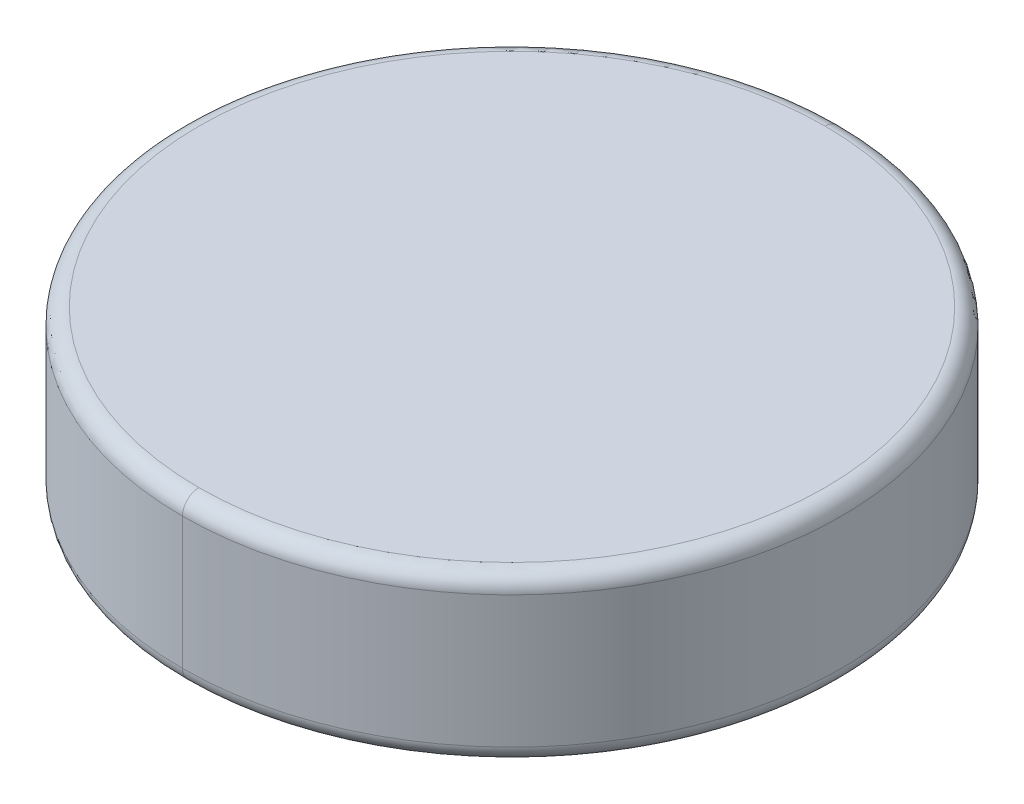
ISO-10303-21;
HEADER;
FILE_DESCRIPTION(('STEP AP214'),'2;1');
FILE_NAME('part.step','',(''),(''),'','','');
FILE_SCHEMA(('AUTOMOTIVE_DESIGN { 1 0 10303 214 1 1 1 1 }'));
ENDSEC;
DATA;
#1=APPLICATION_CONTEXT('core data for automotive mechanical design processes');
#2=APPLICATION_PROTOCOL_DEFINITION('international standard','automotive_design',2000,#1);
#3=PRODUCT_CONTEXT('',#1,'mechanical');
#4=PRODUCT('Part','Part','',(#3));
#5=PRODUCT_RELATED_PRODUCT_CATEGORY('part','',(#4));
#6=PRODUCT_DEFINITION_FORMATION('','',#4);
#7=PRODUCT_DEFINITION_CONTEXT('part definition',#1,'design');
#8=PRODUCT_DEFINITION('design','',#6,#7);
#9=PRODUCT_DEFINITION_SHAPE('','',#8);
#10=(LENGTH_UNIT() NAMED_UNIT(*) SI_UNIT(.MILLI.,.METRE.));
#11=(NAMED_UNIT(*) PLANE_ANGLE_UNIT() SI_UNIT($,.RADIAN.));
#12=(NAMED_UNIT(*) SI_UNIT($,.STERADIAN.) SOLID_ANGLE_UNIT());
#13=UNCERTAINTY_MEASURE_WITH_UNIT(LENGTH_MEASURE(1.E-05),#10,'distance_accuracy_value','');
#14=(GEOMETRIC_REPRESENTATION_CONTEXT(3) GLOBAL_UNCERTAINTY_ASSIGNED_CONTEXT((#13)) GLOBAL_UNIT_ASSIGNED_CONTEXT((#10,
#11,#12)) REPRESENTATION_CONTEXT('',''));
#15=CARTESIAN_POINT('',(0.,0.,0.));
#16=DIRECTION('',(0.,0.,1.));
#17=DIRECTION('',(1.,0.,0.));
#18=AXIS2_PLACEMENT_3D('',#15,#16,#17);
#19=CARTESIAN_POINT('',(0.,1.27,0.));
#20=DIRECTION('',(0.,1.,0.));
#21=DIRECTION('',(0.,0.,1.));
#22=AXIS2_PLACEMENT_3D('',#19,#20,#21);
#23=TOROIDAL_SURFACE('',#22,6.0325,0.3175);
#24=CARTESIAN_POINT('',(0.,1.27,-6.0325));
#25=DIRECTION('',(1.,0.,0.));
#26=DIRECTION('',(0.,0.,-1.));
#27=AXIS2_PLACEMENT_3D('',#24,#25,#26);
#28=CIRCLE('',#27,0.3175);
#29=CARTESIAN_POINT('',(0.,1.27,-6.35));
#30=VERTEX_POINT('',#29);
#31=CARTESIAN_POINT('',(0.,1.5875,-6.0325));
#32=VERTEX_POINT('',#31);
#33=EDGE_CURVE('E99',#30,#32,#28,.T.);
#34=ORIENTED_EDGE('',*,*,#33,.F.);
#35=CARTESIAN_POINT('',(0.,1.27,0.));
#36=DIRECTION('',(0.,-1.,0.));
#37=DIRECTION('',(0.,0.,1.));
#38=AXIS2_PLACEMENT_3D('',#35,#36,#37);
#39=CIRCLE('',#38,6.35);
#40=CARTESIAN_POINT('',(0.,1.27,6.35));
#41=VERTEX_POINT('',#40);
#42=EDGE_CURVE('E97',#41,#30,#39,.T.);
#43=ORIENTED_EDGE('',*,*,#42,.F.);
#44=CARTESIAN_POINT('',(0.,1.27,6.0325));
#45=DIRECTION('',(-1.,0.,0.));
#46=DIRECTION('',(0.,0.,1.));
#47=AXIS2_PLACEMENT_3D('',#44,#45,#46);
#48=CIRCLE('',#47,0.3175);
#49=CARTESIAN_POINT('',(0.,1.5875,6.0325));
#50=VERTEX_POINT('',#49);
#51=EDGE_CURVE('E83',#41,#50,#48,.T.);
#52=ORIENTED_EDGE('',*,*,#51,.T.);
#53=CARTESIAN_POINT('',(0.,1.5875,0.));
#54=DIRECTION('',(0.,1.,0.));
#55=DIRECTION('',(0.,0.,1.));
#56=AXIS2_PLACEMENT_3D('',#53,#54,#55);
#57=CIRCLE('',#56,6.0325);
#58=EDGE_CURVE('E26',#32,#50,#57,.T.);
#59=ORIENTED_EDGE('',*,*,#58,.F.);
#60=EDGE_LOOP('',(#34,#43,#52,#59));
#61=FACE_BOUND('',#60,.T.);
#62=ADVANCED_FACE('F15',(#61),#23,.T.);
#63=CARTESIAN_POINT('',(0.,-1.27,0.));
#64=DIRECTION('',(0.,1.,0.));
#65=DIRECTION('',(0.,0.,1.));
#66=AXIS2_PLACEMENT_3D('',#63,#64,#65);
#67=TOROIDAL_SURFACE('',#66,6.0325,0.3175);
#68=CARTESIAN_POINT('',(0.,-1.27,-6.0325));
#69=DIRECTION('',(1.,0.,0.));
#70=DIRECTION('',(0.,0.,-1.));
#71=AXIS2_PLACEMENT_3D('',#68,#69,#70);
#72=CIRCLE('',#71,0.3175);
#73=CARTESIAN_POINT('',(0.,-1.5875,-6.0325));
#74=VERTEX_POINT('',#73);
#75=CARTESIAN_POINT('',(0.,-1.27,-6.35));
#76=VERTEX_POINT('',#75);
#77=EDGE_CURVE('E74',#74,#76,#72,.T.);
#78=ORIENTED_EDGE('',*,*,#77,.F.);
#79=CARTESIAN_POINT('',(0.,-1.5875,0.));
#80=DIRECTION('',(0.,-1.,0.));
#81=DIRECTION('',(0.,0.,1.));
#82=AXIS2_PLACEMENT_3D('',#79,#80,#81);
#83=CIRCLE('',#82,6.0325);
#84=CARTESIAN_POINT('',(0.,-1.5875,6.0325));
#85=VERTEX_POINT('',#84);
#86=EDGE_CURVE('E10',#85,#74,#83,.T.);
#87=ORIENTED_EDGE('',*,*,#86,.F.);
#88=CARTESIAN_POINT('',(0.,-1.27,6.0325));
#89=DIRECTION('',(-1.,0.,0.));
#90=DIRECTION('',(0.,0.,1.));
#91=AXIS2_PLACEMENT_3D('',#88,#89,#90);
#92=CIRCLE('',#91,0.3175);
#93=CARTESIAN_POINT('',(0.,-1.27,6.35));
#94=VERTEX_POINT('',#93);
#95=EDGE_CURVE('E81',#85,#94,#92,.T.);
#96=ORIENTED_EDGE('',*,*,#95,.T.);
#97=CARTESIAN_POINT('',(0.,-1.27,0.));
#98=DIRECTION('',(0.,1.,0.));
#99=DIRECTION('',(0.,0.,1.));
#100=AXIS2_PLACEMENT_3D('',#97,#98,#99);
#101=CIRCLE('',#100,6.35);
#102=EDGE_CURVE('E19',#76,#94,#101,.T.);
#103=ORIENTED_EDGE('',*,*,#102,.F.);
#104=EDGE_LOOP('',(#78,#87,#96,#103));
#105=FACE_BOUND('',#104,.T.);
#106=ADVANCED_FACE('F17',(#105),#67,.T.);
#107=CARTESIAN_POINT('',(0.,-1.5875,0.));
#108=DIRECTION('',(0.,1.,0.));
#109=DIRECTION('',(1.,0.,0.));
#110=AXIS2_PLACEMENT_3D('',#107,#108,#109);
#111=PLANE('',#110);
#112=ORIENTED_EDGE('',*,*,#86,.T.);
#113=CARTESIAN_POINT('',(0.,-1.5875,0.));
#114=DIRECTION('',(0.,-1.,0.));
#115=DIRECTION('',(0.,0.,1.));
#116=AXIS2_PLACEMENT_3D('',#113,#114,#115);
#117=CIRCLE('',#116,6.0325);
#118=EDGE_CURVE('E72',#74,#85,#117,.T.);
#119=ORIENTED_EDGE('',*,*,#118,.T.);
#120=EDGE_LOOP('',(#112,#119));
#121=FACE_BOUND('',#120,.T.);
#122=ADVANCED_FACE('F70',(#121),#111,.F.);
#123=CARTESIAN_POINT('',(0.,1.5875,0.));
#124=DIRECTION('',(0.,1.,0.));
#125=DIRECTION('',(1.,0.,0.));
#126=AXIS2_PLACEMENT_3D('',#123,#124,#125);
#127=PLANE('',#126);
#128=CARTESIAN_POINT('',(0.,1.5875,0.));
#129=DIRECTION('',(0.,1.,0.));
#130=DIRECTION('',(0.,0.,1.));
#131=AXIS2_PLACEMENT_3D('',#128,#129,#130);
#132=CIRCLE('',#131,6.0325);
#133=EDGE_CURVE('E91',#50,#32,#132,.T.);
#134=ORIENTED_EDGE('',*,*,#133,.T.);
#135=ORIENTED_EDGE('',*,*,#58,.T.);
#136=EDGE_LOOP('',(#134,#135));
#137=FACE_BOUND('',#136,.T.);
#138=ADVANCED_FACE('F139',(#137),#127,.T.);
#139=CARTESIAN_POINT('',(0.,1.5875,0.));
#140=DIRECTION('',(0.,-1.,0.));
#141=DIRECTION('',(0.,0.,-1.));
#142=AXIS2_PLACEMENT_3D('',#139,#140,#141);
#143=CYLINDRICAL_SURFACE('',#142,6.35);
#144=DIRECTION('',(0.,-1.,0.));
#145=VECTOR('',#144,1.);
#146=CARTESIAN_POINT('',(0.,1.5875,6.35));
#147=LINE('',#146,#145);
#148=EDGE_CURVE('E98',#41,#94,#147,.T.);
#149=ORIENTED_EDGE('',*,*,#148,.F.);
#150=ORIENTED_EDGE('',*,*,#42,.T.);
#151=DIRECTION('',(0.,-1.,0.));
#152=VECTOR('',#151,1.);
#153=CARTESIAN_POINT('',(0.,1.5875,-6.35));
#154=LINE('',#153,#152);
#155=EDGE_CURVE('E95',#30,#76,#154,.T.);
#156=ORIENTED_EDGE('',*,*,#155,.T.);
#157=ORIENTED_EDGE('',*,*,#102,.T.);
#158=EDGE_LOOP('',(#149,#150,#156,#157));
#159=FACE_BOUND('',#158,.T.);
#160=ADVANCED_FACE('F125',(#159),#143,.T.);
#161=CARTESIAN_POINT('',(0.,1.5875,0.));
#162=DIRECTION('',(0.,-1.,0.));
#163=DIRECTION('',(0.,0.,-1.));
#164=AXIS2_PLACEMENT_3D('',#161,#162,#163);
#165=CYLINDRICAL_SURFACE('',#164,6.35);
#166=CARTESIAN_POINT('',(0.,1.27,0.));
#167=DIRECTION('',(0.,-1.,0.));
#168=DIRECTION('',(0.,0.,1.));
#169=AXIS2_PLACEMENT_3D('',#166,#167,#168);
#170=CIRCLE('',#169,6.35);
#171=EDGE_CURVE('E94',#30,#41,#170,.T.);
#172=ORIENTED_EDGE('',*,*,#171,.T.);
#173=ORIENTED_EDGE('',*,*,#148,.T.);
#174=CARTESIAN_POINT('',(0.,-1.27,0.));
#175=DIRECTION('',(0.,1.,0.));
#176=DIRECTION('',(0.,0.,1.));
#177=AXIS2_PLACEMENT_3D('',#174,#175,#176);
#178=CIRCLE('',#177,6.35);
#179=EDGE_CURVE('E78',#94,#76,#178,.T.);
#180=ORIENTED_EDGE('',*,*,#179,.T.);
#181=ORIENTED_EDGE('',*,*,#155,.F.);
#182=EDGE_LOOP('',(#172,#173,#180,#181));
#183=FACE_BOUND('',#182,.T.);
#184=ADVANCED_FACE('F116',(#183),#165,.T.);
#185=CARTESIAN_POINT('',(0.,-1.27,0.));
#186=DIRECTION('',(0.,1.,0.));
#187=DIRECTION('',(0.,0.,1.));
#188=AXIS2_PLACEMENT_3D('',#185,#186,#187);
#189=TOROIDAL_SURFACE('',#188,6.0325,0.3175);
#190=ORIENTED_EDGE('',*,*,#118,.F.);
#191=ORIENTED_EDGE('',*,*,#77,.T.);
#192=ORIENTED_EDGE('',*,*,#179,.F.);
#193=ORIENTED_EDGE('',*,*,#95,.F.);
#194=EDGE_LOOP('',(#190,#191,#192,#193));
#195=FACE_BOUND('',#194,.T.);
#196=ADVANCED_FACE('F80',(#195),#189,.T.);
#197=CARTESIAN_POINT('',(0.,1.27,0.));
#198=DIRECTION('',(0.,1.,0.));
#199=DIRECTION('',(0.,0.,1.));
#200=AXIS2_PLACEMENT_3D('',#197,#198,#199);
#201=TOROIDAL_SURFACE('',#200,6.0325,0.3175);
#202=ORIENTED_EDGE('',*,*,#171,.F.);
#203=ORIENTED_EDGE('',*,*,#33,.T.);
#204=ORIENTED_EDGE('',*,*,#133,.F.);
#205=ORIENTED_EDGE('',*,*,#51,.F.);
#206=EDGE_LOOP('',(#202,#203,#204,#205));
#207=FACE_BOUND('',#206,.T.);
#208=ADVANCED_FACE('F119',(#207),#201,.T.);
#209=CLOSED_SHELL('',(#62,#106,#122,#138,#160,#184,#196,#208));
#210=MANIFOLD_SOLID_BREP('B1',#209);
#211=ADVANCED_BREP_SHAPE_REPRESENTATION('',(#18,#210),#14);
#212=SHAPE_DEFINITION_REPRESENTATION(#9,#211);
ENDSEC;
END-ISO-10303-21;
